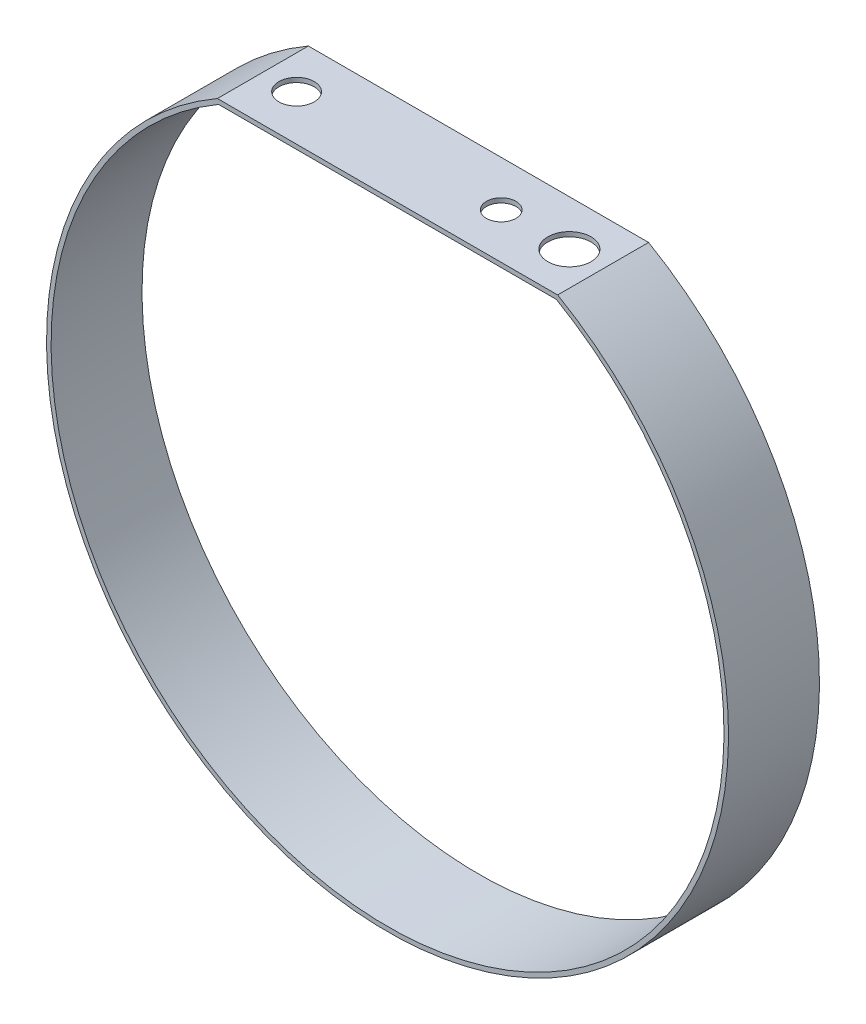
ISO-10303-21;
HEADER;
FILE_DESCRIPTION(('STEP AP214'),'2;1');
FILE_NAME('part.step','',(''),(''),'','','');
FILE_SCHEMA(('AUTOMOTIVE_DESIGN { 1 0 10303 214 1 1 1 1 }'));
ENDSEC;
DATA;
#1=APPLICATION_CONTEXT('core data for automotive mechanical design processes');
#2=APPLICATION_PROTOCOL_DEFINITION('international standard','automotive_design',2000,#1);
#3=PRODUCT_CONTEXT('',#1,'mechanical');
#4=PRODUCT('Part','Part','',(#3));
#5=PRODUCT_RELATED_PRODUCT_CATEGORY('part','',(#4));
#6=PRODUCT_DEFINITION_FORMATION('','',#4);
#7=PRODUCT_DEFINITION_CONTEXT('part definition',#1,'design');
#8=PRODUCT_DEFINITION('design','',#6,#7);
#9=PRODUCT_DEFINITION_SHAPE('','',#8);
#10=(LENGTH_UNIT() NAMED_UNIT(*) SI_UNIT(.MILLI.,.METRE.));
#11=(NAMED_UNIT(*) PLANE_ANGLE_UNIT() SI_UNIT($,.RADIAN.));
#12=(NAMED_UNIT(*) SI_UNIT($,.STERADIAN.) SOLID_ANGLE_UNIT());
#13=UNCERTAINTY_MEASURE_WITH_UNIT(LENGTH_MEASURE(1.E-05),#10,'distance_accuracy_value','');
#14=(GEOMETRIC_REPRESENTATION_CONTEXT(3) GLOBAL_UNCERTAINTY_ASSIGNED_CONTEXT((#13)) GLOBAL_UNIT_ASSIGNED_CONTEXT((#10,
#11,#12)) REPRESENTATION_CONTEXT('',''));
#15=CARTESIAN_POINT('',(0.,0.,0.));
#16=DIRECTION('',(0.,0.,1.));
#17=DIRECTION('',(1.,0.,0.));
#18=AXIS2_PLACEMENT_3D('',#15,#16,#17);
#19=CARTESIAN_POINT('',(0.,0.,40.));
#20=DIRECTION('',(0.,0.,1.));
#21=DIRECTION('',(1.,0.,0.));
#22=AXIS2_PLACEMENT_3D('',#19,#20,#21);
#23=PLANE('',#22);
#24=CARTESIAN_POINT('',(0.,0.,40.));
#25=DIRECTION('',(0.,0.,1.));
#26=DIRECTION('',(1.,0.,0.));
#27=AXIS2_PLACEMENT_3D('',#24,#25,#26);
#28=CIRCLE('',#27,150.);
#29=CARTESIAN_POINT('',(-74.8331477354789,130.,40.));
#30=VERTEX_POINT('',#29);
#31=CARTESIAN_POINT('',(74.8331477354789,130.,40.));
#32=VERTEX_POINT('',#31);
#33=EDGE_CURVE('E94',#30,#32,#28,.T.);
#34=ORIENTED_EDGE('',*,*,#33,.T.);
#35=DIRECTION('',(-1.,0.,0.));
#36=VECTOR('',#35,1.);
#37=CARTESIAN_POINT('',(-74.8331477354789,130.,40.));
#38=LINE('',#37,#36);
#39=EDGE_CURVE('E97',#32,#30,#38,.T.);
#40=ORIENTED_EDGE('',*,*,#39,.T.);
#41=EDGE_LOOP('',(#34,#40));
#42=FACE_BOUND('',#41,.T.);
#43=DIRECTION('',(-1.,0.,0.));
#44=VECTOR('',#43,1.);
#45=CARTESIAN_POINT('',(-74.2967024840268,128.,40.));
#46=LINE('',#45,#44);
#47=CARTESIAN_POINT('',(74.2967024840268,128.,40.));
#48=VERTEX_POINT('',#47);
#49=CARTESIAN_POINT('',(-74.2967024840268,128.,40.));
#50=VERTEX_POINT('',#49);
#51=EDGE_CURVE('E73',#48,#50,#46,.T.);
#52=ORIENTED_EDGE('',*,*,#51,.F.);
#53=CARTESIAN_POINT('',(0.,0.,40.));
#54=DIRECTION('',(0.,0.,1.));
#55=DIRECTION('',(1.,0.,0.));
#56=AXIS2_PLACEMENT_3D('',#53,#54,#55);
#57=CIRCLE('',#56,148.);
#58=EDGE_CURVE('E79',#50,#48,#57,.T.);
#59=ORIENTED_EDGE('',*,*,#58,.F.);
#60=EDGE_LOOP('',(#52,#59));
#61=FACE_BOUND('',#60,.T.);
#62=ADVANCED_FACE('F33',(#42,#61),#23,.T.);
#63=CARTESIAN_POINT('',(0.,0.,0.));
#64=DIRECTION('',(0.,0.,1.));
#65=DIRECTION('',(1.,0.,0.));
#66=AXIS2_PLACEMENT_3D('',#63,#64,#65);
#67=PLANE('',#66);
#68=CARTESIAN_POINT('',(0.,0.,0.));
#69=DIRECTION('',(0.,0.,1.));
#70=DIRECTION('',(1.,0.,0.));
#71=AXIS2_PLACEMENT_3D('',#68,#69,#70);
#72=CIRCLE('',#71,150.);
#73=CARTESIAN_POINT('',(-74.8331477354789,130.,0.));
#74=VERTEX_POINT('',#73);
#75=CARTESIAN_POINT('',(74.8331477354789,130.,0.));
#76=VERTEX_POINT('',#75);
#77=EDGE_CURVE('E93',#74,#76,#72,.T.);
#78=ORIENTED_EDGE('',*,*,#77,.F.);
#79=DIRECTION('',(-1.,0.,0.));
#80=VECTOR('',#79,1.);
#81=CARTESIAN_POINT('',(-74.8331477354789,130.,0.));
#82=LINE('',#81,#80);
#83=EDGE_CURVE('E98',#76,#74,#82,.T.);
#84=ORIENTED_EDGE('',*,*,#83,.F.);
#85=EDGE_LOOP('',(#78,#84));
#86=FACE_BOUND('',#85,.T.);
#87=CARTESIAN_POINT('',(0.,0.,0.));
#88=DIRECTION('',(0.,0.,1.));
#89=DIRECTION('',(1.,0.,0.));
#90=AXIS2_PLACEMENT_3D('',#87,#88,#89);
#91=CIRCLE('',#90,148.);
#92=CARTESIAN_POINT('',(-74.2967024840268,128.,0.));
#93=VERTEX_POINT('',#92);
#94=CARTESIAN_POINT('',(74.2967024840268,128.,0.));
#95=VERTEX_POINT('',#94);
#96=EDGE_CURVE('E55',#93,#95,#91,.T.);
#97=ORIENTED_EDGE('',*,*,#96,.T.);
#98=DIRECTION('',(-1.,0.,0.));
#99=VECTOR('',#98,1.);
#100=CARTESIAN_POINT('',(-74.2967024840268,128.,0.));
#101=LINE('',#100,#99);
#102=EDGE_CURVE('E83',#95,#93,#101,.T.);
#103=ORIENTED_EDGE('',*,*,#102,.T.);
#104=EDGE_LOOP('',(#97,#103));
#105=FACE_BOUND('',#104,.T.);
#106=ADVANCED_FACE('F110',(#86,#105),#67,.F.);
#107=CARTESIAN_POINT('',(0.,0.,40.));
#108=DIRECTION('',(0.,0.,-1.));
#109=DIRECTION('',(-1.,0.,0.));
#110=AXIS2_PLACEMENT_3D('',#107,#108,#109);
#111=CYLINDRICAL_SURFACE('',#110,150.);
#112=ORIENTED_EDGE('',*,*,#77,.T.);
#113=DIRECTION('',(0.,0.,-1.));
#114=VECTOR('',#113,1.);
#115=CARTESIAN_POINT('',(74.8331477354789,130.,40.));
#116=LINE('',#115,#114);
#117=EDGE_CURVE('E11',#32,#76,#116,.T.);
#118=ORIENTED_EDGE('',*,*,#117,.F.);
#119=ORIENTED_EDGE('',*,*,#33,.F.);
#120=DIRECTION('',(0.,0.,-1.));
#121=VECTOR('',#120,1.);
#122=CARTESIAN_POINT('',(-74.8331477354789,130.,40.));
#123=LINE('',#122,#121);
#124=EDGE_CURVE('E41',#30,#74,#123,.T.);
#125=ORIENTED_EDGE('',*,*,#124,.T.);
#126=EDGE_LOOP('',(#112,#118,#119,#125));
#127=FACE_BOUND('',#126,.T.);
#128=ADVANCED_FACE('F35',(#127),#111,.T.);
#129=CARTESIAN_POINT('',(-74.8331477354789,130.,40.));
#130=DIRECTION('',(0.,-1.,0.));
#131=DIRECTION('',(0.,0.,-1.));
#132=AXIS2_PLACEMENT_3D('',#129,#130,#131);
#133=PLANE('',#132);
#134=CARTESIAN_POINT('',(30.,130.,20.));
#135=DIRECTION('',(0.,1.,0.));
#136=DIRECTION('',(0.,0.,1.));
#137=AXIS2_PLACEMENT_3D('',#134,#135,#136);
#138=CIRCLE('',#137,6.5);
#139=CARTESIAN_POINT('',(30.,130.,26.5));
#140=VERTEX_POINT('',#139);
#141=EDGE_CURVE('E133',#140,#140,#138,.T.);
#142=ORIENTED_EDGE('',*,*,#141,.F.);
#143=EDGE_LOOP('',(#142));
#144=FACE_BOUND('',#143,.T.);
#145=CARTESIAN_POINT('',(60.,130.,20.));
#146=DIRECTION('',(0.,1.,0.));
#147=DIRECTION('',(0.,0.,1.));
#148=AXIS2_PLACEMENT_3D('',#145,#146,#147);
#149=CIRCLE('',#148,9.5);
#150=CARTESIAN_POINT('',(60.,130.,29.5));
#151=VERTEX_POINT('',#150);
#152=EDGE_CURVE('E137',#151,#151,#149,.T.);
#153=ORIENTED_EDGE('',*,*,#152,.F.);
#154=EDGE_LOOP('',(#153));
#155=FACE_BOUND('',#154,.T.);
#156=CARTESIAN_POINT('',(-60.,130.,20.));
#157=DIRECTION('',(0.,1.,0.));
#158=DIRECTION('',(0.,0.,1.));
#159=AXIS2_PLACEMENT_3D('',#156,#157,#158);
#160=CIRCLE('',#159,7.75);
#161=CARTESIAN_POINT('',(-60.,130.,27.75));
#162=VERTEX_POINT('',#161);
#163=EDGE_CURVE('E90',#162,#162,#160,.T.);
#164=ORIENTED_EDGE('',*,*,#163,.F.);
#165=EDGE_LOOP('',(#164));
#166=FACE_BOUND('',#165,.T.);
#167=ORIENTED_EDGE('',*,*,#83,.T.);
#168=ORIENTED_EDGE('',*,*,#124,.F.);
#169=ORIENTED_EDGE('',*,*,#39,.F.);
#170=ORIENTED_EDGE('',*,*,#117,.T.);
#171=EDGE_LOOP('',(#167,#168,#169,#170));
#172=FACE_BOUND('',#171,.T.);
#173=ADVANCED_FACE('F112',(#144,#155,#166,#172),#133,.F.);
#174=CARTESIAN_POINT('',(0.,0.,40.));
#175=DIRECTION('',(0.,0.,-1.));
#176=DIRECTION('',(-1.,0.,0.));
#177=AXIS2_PLACEMENT_3D('',#174,#175,#176);
#178=CYLINDRICAL_SURFACE('',#177,148.);
#179=ORIENTED_EDGE('',*,*,#96,.F.);
#180=DIRECTION('',(0.,0.,-1.));
#181=VECTOR('',#180,1.);
#182=CARTESIAN_POINT('',(-74.2967024840268,128.,40.));
#183=LINE('',#182,#181);
#184=EDGE_CURVE('E75',#50,#93,#183,.T.);
#185=ORIENTED_EDGE('',*,*,#184,.F.);
#186=ORIENTED_EDGE('',*,*,#58,.T.);
#187=DIRECTION('',(0.,0.,-1.));
#188=VECTOR('',#187,1.);
#189=CARTESIAN_POINT('',(74.2967024840268,128.,40.));
#190=LINE('',#189,#188);
#191=EDGE_CURVE('E48',#48,#95,#190,.T.);
#192=ORIENTED_EDGE('',*,*,#191,.T.);
#193=EDGE_LOOP('',(#179,#185,#186,#192));
#194=FACE_BOUND('',#193,.T.);
#195=ADVANCED_FACE('F81',(#194),#178,.F.);
#196=CARTESIAN_POINT('',(-74.2967024840268,128.,40.));
#197=DIRECTION('',(0.,-1.,0.));
#198=DIRECTION('',(0.,0.,-1.));
#199=AXIS2_PLACEMENT_3D('',#196,#197,#198);
#200=PLANE('',#199);
#201=CARTESIAN_POINT('',(30.,128.,20.));
#202=DIRECTION('',(0.,-1.,0.));
#203=DIRECTION('',(0.,0.,-1.));
#204=AXIS2_PLACEMENT_3D('',#201,#202,#203);
#205=CIRCLE('',#204,6.5);
#206=CARTESIAN_POINT('',(30.,128.,13.5));
#207=VERTEX_POINT('',#206);
#208=EDGE_CURVE('E147',#207,#207,#205,.F.);
#209=ORIENTED_EDGE('',*,*,#208,.T.);
#210=EDGE_LOOP('',(#209));
#211=FACE_BOUND('',#210,.T.);
#212=CARTESIAN_POINT('',(60.,128.,20.));
#213=DIRECTION('',(0.,-1.,0.));
#214=DIRECTION('',(0.,0.,-1.));
#215=AXIS2_PLACEMENT_3D('',#212,#213,#214);
#216=CIRCLE('',#215,9.5);
#217=CARTESIAN_POINT('',(60.,128.,10.5));
#218=VERTEX_POINT('',#217);
#219=EDGE_CURVE('E143',#218,#218,#216,.F.);
#220=ORIENTED_EDGE('',*,*,#219,.T.);
#221=EDGE_LOOP('',(#220));
#222=FACE_BOUND('',#221,.T.);
#223=CARTESIAN_POINT('',(-60.,128.,20.));
#224=DIRECTION('',(0.,-1.,0.));
#225=DIRECTION('',(0.,0.,-1.));
#226=AXIS2_PLACEMENT_3D('',#223,#224,#225);
#227=CIRCLE('',#226,7.75);
#228=CARTESIAN_POINT('',(-60.,128.,12.25));
#229=VERTEX_POINT('',#228);
#230=EDGE_CURVE('E87',#229,#229,#227,.F.);
#231=ORIENTED_EDGE('',*,*,#230,.T.);
#232=EDGE_LOOP('',(#231));
#233=FACE_BOUND('',#232,.T.);
#234=ORIENTED_EDGE('',*,*,#102,.F.);
#235=ORIENTED_EDGE('',*,*,#191,.F.);
#236=ORIENTED_EDGE('',*,*,#51,.T.);
#237=ORIENTED_EDGE('',*,*,#184,.T.);
#238=EDGE_LOOP('',(#234,#235,#236,#237));
#239=FACE_BOUND('',#238,.T.);
#240=ADVANCED_FACE('F74',(#211,#222,#233,#239),#200,.T.);
#241=CARTESIAN_POINT('',(-60.,-150.001,20.));
#242=DIRECTION('',(0.,1.,0.));
#243=DIRECTION('',(0.,0.,1.));
#244=AXIS2_PLACEMENT_3D('',#241,#242,#243);
#245=CYLINDRICAL_SURFACE('',#244,7.75);
#246=ORIENTED_EDGE('',*,*,#230,.F.);
#247=EDGE_LOOP('',(#246));
#248=FACE_BOUND('',#247,.T.);
#249=ORIENTED_EDGE('',*,*,#163,.T.);
#250=EDGE_LOOP('',(#249));
#251=FACE_BOUND('',#250,.T.);
#252=ADVANCED_FACE('F159',(#248,#251),#245,.F.);
#253=CARTESIAN_POINT('',(60.,-150.001,20.));
#254=DIRECTION('',(0.,1.,0.));
#255=DIRECTION('',(0.,0.,1.));
#256=AXIS2_PLACEMENT_3D('',#253,#254,#255);
#257=CYLINDRICAL_SURFACE('',#256,9.5);
#258=ORIENTED_EDGE('',*,*,#219,.F.);
#259=EDGE_LOOP('',(#258));
#260=FACE_BOUND('',#259,.T.);
#261=ORIENTED_EDGE('',*,*,#152,.T.);
#262=EDGE_LOOP('',(#261));
#263=FACE_BOUND('',#262,.T.);
#264=ADVANCED_FACE('F153',(#260,#263),#257,.F.);
#265=CARTESIAN_POINT('',(30.,-150.001,20.));
#266=DIRECTION('',(0.,1.,0.));
#267=DIRECTION('',(0.,0.,1.));
#268=AXIS2_PLACEMENT_3D('',#265,#266,#267);
#269=CYLINDRICAL_SURFACE('',#268,6.5);
#270=ORIENTED_EDGE('',*,*,#208,.F.);
#271=EDGE_LOOP('',(#270));
#272=FACE_BOUND('',#271,.T.);
#273=ORIENTED_EDGE('',*,*,#141,.T.);
#274=EDGE_LOOP('',(#273));
#275=FACE_BOUND('',#274,.T.);
#276=ADVANCED_FACE('F151',(#272,#275),#269,.F.);
#277=CLOSED_SHELL('',(#62,#106,#128,#173,#195,#240,#252,#264,#276));
#278=MANIFOLD_SOLID_BREP('B2',#277);
#279=ADVANCED_BREP_SHAPE_REPRESENTATION('',(#18,#278),#14);
#280=SHAPE_DEFINITION_REPRESENTATION(#9,#279);
ENDSEC;
END-ISO-10303-21;
